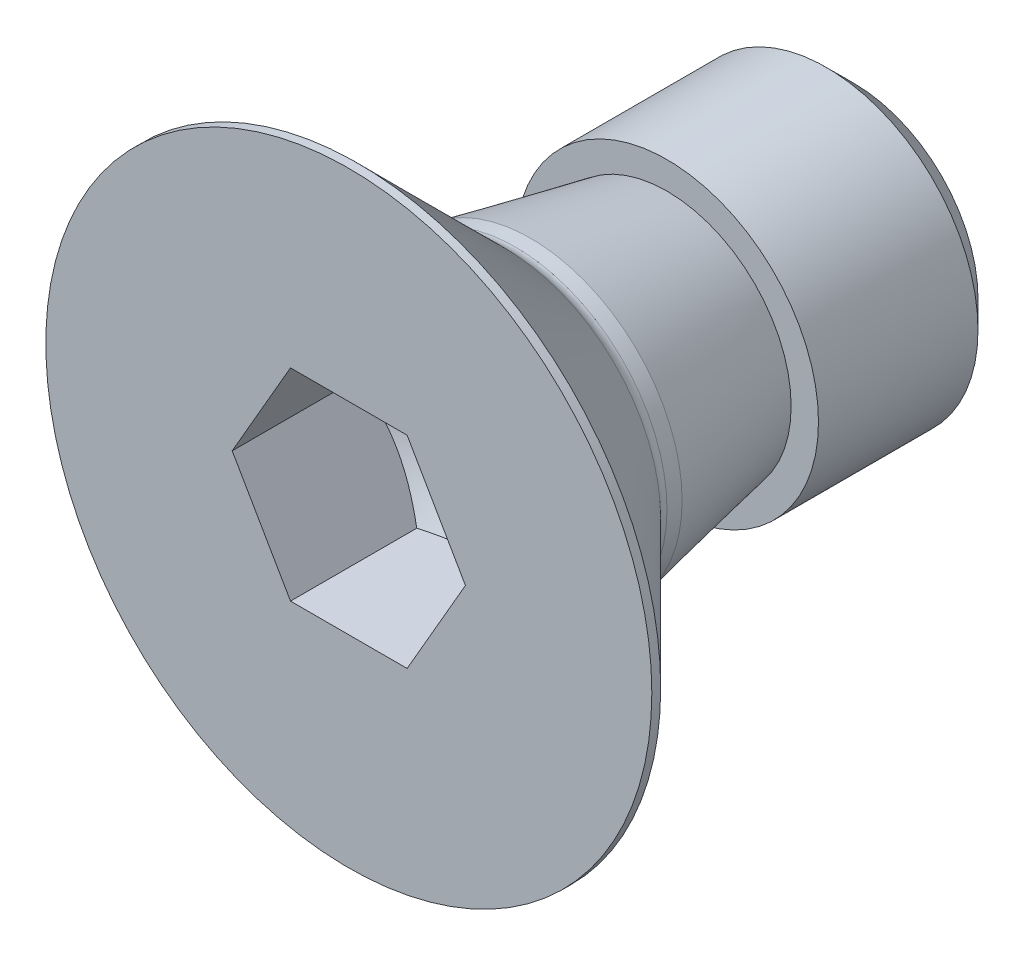
ISO-10303-21;
HEADER;
FILE_DESCRIPTION(('STEP AP214'),'2;1');
FILE_NAME('part.step','',(''),(''),'','','');
FILE_SCHEMA(('AUTOMOTIVE_DESIGN { 1 0 10303 214 1 1 1 1 }'));
ENDSEC;
DATA;
#1=APPLICATION_CONTEXT('core data for automotive mechanical design processes');
#2=APPLICATION_PROTOCOL_DEFINITION('international standard','automotive_design',2000,#1);
#3=PRODUCT_CONTEXT('',#1,'mechanical');
#4=PRODUCT('Part','Part','',(#3));
#5=PRODUCT_RELATED_PRODUCT_CATEGORY('part','',(#4));
#6=PRODUCT_DEFINITION_FORMATION('','',#4);
#7=PRODUCT_DEFINITION_CONTEXT('part definition',#1,'design');
#8=PRODUCT_DEFINITION('design','',#6,#7);
#9=PRODUCT_DEFINITION_SHAPE('','',#8);
#10=(LENGTH_UNIT() NAMED_UNIT(*) SI_UNIT(.MILLI.,.METRE.));
#11=(NAMED_UNIT(*) PLANE_ANGLE_UNIT() SI_UNIT($,.RADIAN.));
#12=(NAMED_UNIT(*) SI_UNIT($,.STERADIAN.) SOLID_ANGLE_UNIT());
#13=UNCERTAINTY_MEASURE_WITH_UNIT(LENGTH_MEASURE(1.E-05),#10,'distance_accuracy_value','');
#14=(GEOMETRIC_REPRESENTATION_CONTEXT(3) GLOBAL_UNCERTAINTY_ASSIGNED_CONTEXT((#13)) GLOBAL_UNIT_ASSIGNED_CONTEXT((#10,
#11,#12)) REPRESENTATION_CONTEXT('',''));
#15=CARTESIAN_POINT('',(0.,0.,0.));
#16=DIRECTION('',(0.,0.,1.));
#17=DIRECTION('',(1.,0.,0.));
#18=AXIS2_PLACEMENT_3D('',#15,#16,#17);
#19=CARTESIAN_POINT('',(0.,0.,0.));
#20=DIRECTION('',(0.,0.,1.));
#21=DIRECTION('',(1.,0.,0.));
#22=AXIS2_PLACEMENT_3D('',#19,#20,#21);
#23=CYLINDRICAL_SURFACE('',#22,3.);
#24=CARTESIAN_POINT('',(0.,0.,-3.3));
#25=DIRECTION('',(0.,0.,1.));
#26=DIRECTION('',(1.,0.,0.));
#27=AXIS2_PLACEMENT_3D('',#24,#25,#26);
#28=CIRCLE('',#27,3.);
#29=CARTESIAN_POINT('',(3.,0.,-3.3));
#30=VERTEX_POINT('',#29);
#31=EDGE_CURVE('E224',#30,#30,#28,.T.);
#32=ORIENTED_EDGE('',*,*,#31,.F.);
#33=EDGE_LOOP('',(#32));
#34=FACE_BOUND('',#33,.T.);
#35=CARTESIAN_POINT('',(0.,0.,-3.6));
#36=DIRECTION('',(0.,0.,1.));
#37=DIRECTION('',(1.,0.,0.));
#38=AXIS2_PLACEMENT_3D('',#35,#36,#37);
#39=CIRCLE('',#38,3.);
#40=CARTESIAN_POINT('',(3.,0.,-3.6));
#41=VERTEX_POINT('',#40);
#42=EDGE_CURVE('E152',#41,#41,#39,.T.);
#43=ORIENTED_EDGE('',*,*,#42,.T.);
#44=EDGE_LOOP('',(#43));
#45=FACE_BOUND('',#44,.T.);
#46=ADVANCED_FACE('F16',(#34,#45),#23,.T.);
#47=CARTESIAN_POINT('',(0.,6.,0.));
#48=DIRECTION('',(0.,0.,-1.));
#49=DIRECTION('',(-1.,0.,0.));
#50=AXIS2_PLACEMENT_3D('',#47,#48,#49);
#51=PLANE('',#50);
#52=CARTESIAN_POINT('',(0.,0.,0.));
#53=DIRECTION('',(0.,0.,1.));
#54=DIRECTION('',(1.,0.,0.));
#55=AXIS2_PLACEMENT_3D('',#52,#53,#54);
#56=CIRCLE('',#55,6.);
#57=CARTESIAN_POINT('',(6.,0.,0.));
#58=VERTEX_POINT('',#57);
#59=EDGE_CURVE('E206',#58,#58,#56,.T.);
#60=ORIENTED_EDGE('',*,*,#59,.T.);
#61=EDGE_LOOP('',(#60));
#62=FACE_BOUND('',#61,.T.);
#63=DIRECTION('',(0.5,-0.866025403784439,0.));
#64=VECTOR('',#63,1.);
#65=CARTESIAN_POINT('',(1.1547,1.99999906749978,0.));
#66=LINE('',#65,#64);
#67=CARTESIAN_POINT('',(1.1547,1.99999906749978,0.));
#68=VERTEX_POINT('',#67);
#69=CARTESIAN_POINT('',(2.3094,0.,0.));
#70=VERTEX_POINT('',#69);
#71=EDGE_CURVE('E94',#68,#70,#66,.T.);
#72=ORIENTED_EDGE('',*,*,#71,.T.);
#73=DIRECTION('',(-0.5,-0.866025403784439,0.));
#74=VECTOR('',#73,1.);
#75=CARTESIAN_POINT('',(2.3094,0.,0.));
#76=LINE('',#75,#74);
#77=CARTESIAN_POINT('',(1.1547,-1.99999906749978,0.));
#78=VERTEX_POINT('',#77);
#79=EDGE_CURVE('E106',#70,#78,#76,.T.);
#80=ORIENTED_EDGE('',*,*,#79,.T.);
#81=DIRECTION('',(-1.,0.,0.));
#82=VECTOR('',#81,1.);
#83=CARTESIAN_POINT('',(1.1547,-1.99999906749978,0.));
#84=LINE('',#83,#82);
#85=CARTESIAN_POINT('',(-1.1547,-1.99999906749978,0.));
#86=VERTEX_POINT('',#85);
#87=EDGE_CURVE('E195',#78,#86,#84,.T.);
#88=ORIENTED_EDGE('',*,*,#87,.T.);
#89=DIRECTION('',(-0.5,0.866025403784439,0.));
#90=VECTOR('',#89,1.);
#91=CARTESIAN_POINT('',(-1.1547,-1.99999906749978,0.));
#92=LINE('',#91,#90);
#93=CARTESIAN_POINT('',(-2.3094,0.,0.));
#94=VERTEX_POINT('',#93);
#95=EDGE_CURVE('E191',#86,#94,#92,.T.);
#96=ORIENTED_EDGE('',*,*,#95,.T.);
#97=DIRECTION('',(0.5,0.866025403784439,0.));
#98=VECTOR('',#97,1.);
#99=CARTESIAN_POINT('',(-2.3094,0.,0.));
#100=LINE('',#99,#98);
#101=CARTESIAN_POINT('',(-1.1547,1.99999906749978,0.));
#102=VERTEX_POINT('',#101);
#103=EDGE_CURVE('E90',#94,#102,#100,.T.);
#104=ORIENTED_EDGE('',*,*,#103,.T.);
#105=DIRECTION('',(1.,0.,0.));
#106=VECTOR('',#105,1.);
#107=CARTESIAN_POINT('',(-1.1547,1.99999906749978,0.));
#108=LINE('',#107,#106);
#109=EDGE_CURVE('E130',#102,#68,#108,.T.);
#110=ORIENTED_EDGE('',*,*,#109,.T.);
#111=EDGE_LOOP('',(#72,#80,#88,#96,#104,#110));
#112=FACE_BOUND('',#111,.T.);
#113=ADVANCED_FACE('F18',(#62,#112),#51,.F.);
#114=CARTESIAN_POINT('',(0.,0.,-3.3));
#115=DIRECTION('',(0.,0.,1.));
#116=DIRECTION('',(1.,0.,0.));
#117=AXIS2_PLACEMENT_3D('',#114,#115,#116);
#118=TOROIDAL_SURFACE('',#117,3.3,0.3);
#119=ORIENTED_EDGE('',*,*,#31,.T.);
#120=EDGE_LOOP('',(#119));
#121=FACE_BOUND('',#120,.T.);
#122=CARTESIAN_POINT('',(0.,0.,-3.08786796564404));
#123=DIRECTION('',(0.,0.,1.));
#124=DIRECTION('',(1.,0.,0.));
#125=AXIS2_PLACEMENT_3D('',#122,#123,#124);
#126=CIRCLE('',#125,3.08786796564404);
#127=CARTESIAN_POINT('',(3.08786796564404,0.,-3.08786796564404));
#128=VERTEX_POINT('',#127);
#129=EDGE_CURVE('E218',#128,#128,#126,.T.);
#130=ORIENTED_EDGE('',*,*,#129,.F.);
#131=EDGE_LOOP('',(#130));
#132=FACE_BOUND('',#131,.T.);
#133=ADVANCED_FACE('F257',(#121,#132),#118,.F.);
#134=CARTESIAN_POINT('',(0.,0.,-3.08786796564404));
#135=DIRECTION('',(0.,0.,1.));
#136=DIRECTION('',(1.,0.,0.));
#137=AXIS2_PLACEMENT_3D('',#134,#135,#136);
#138=CONICAL_SURFACE('',#137,3.08786796564404,0.785398163397448);
#139=CARTESIAN_POINT('',(0.,0.,-0.175735931288071));
#140=DIRECTION('',(0.,0.,1.));
#141=DIRECTION('',(1.,0.,0.));
#142=AXIS2_PLACEMENT_3D('',#139,#140,#141);
#143=CIRCLE('',#142,6.);
#144=CARTESIAN_POINT('',(6.,0.,-0.175735931288071));
#145=VERTEX_POINT('',#144);
#146=EDGE_CURVE('E211',#145,#145,#143,.T.);
#147=ORIENTED_EDGE('',*,*,#146,.F.);
#148=EDGE_LOOP('',(#147));
#149=FACE_BOUND('',#148,.T.);
#150=ORIENTED_EDGE('',*,*,#129,.T.);
#151=EDGE_LOOP('',(#150));
#152=FACE_BOUND('',#151,.T.);
#153=ADVANCED_FACE('F352',(#149,#152),#138,.T.);
#154=CARTESIAN_POINT('',(0.,0.,0.));
#155=DIRECTION('',(0.,0.,1.));
#156=DIRECTION('',(1.,0.,0.));
#157=AXIS2_PLACEMENT_3D('',#154,#155,#156);
#158=CYLINDRICAL_SURFACE('',#157,6.);
#159=ORIENTED_EDGE('',*,*,#59,.F.);
#160=EDGE_LOOP('',(#159));
#161=FACE_BOUND('',#160,.T.);
#162=ORIENTED_EDGE('',*,*,#146,.T.);
#163=EDGE_LOOP('',(#162));
#164=FACE_BOUND('',#163,.T.);
#165=ADVANCED_FACE('F182',(#161,#164),#158,.T.);
#166=CARTESIAN_POINT('',(1.1547,1.99999906749978,-4.83333271166652));
#167=DIRECTION('',(-0.866025403784439,-0.5,0.));
#168=DIRECTION('',(-0.5,0.866025403784439,0.));
#169=AXIS2_PLACEMENT_3D('',#166,#167,#168);
#170=PLANE('',#169);
#171=DIRECTION('',(0.,0.,1.));
#172=VECTOR('',#171,1.);
#173=CARTESIAN_POINT('',(1.1547,1.99999906749978,-4.83333271166652));
#174=LINE('',#173,#172);
#175=CARTESIAN_POINT('',(1.1547,1.99999906749978,-2.5));
#176=VERTEX_POINT('',#175);
#177=EDGE_CURVE('E32',#176,#68,#174,.T.);
#178=ORIENTED_EDGE('',*,*,#177,.F.);
#179=CARTESIAN_POINT('',(2.30940115470054,-2.E-06,-2.49999933333283));
#180=CARTESIAN_POINT('',(2.2586590633301,0.0878858803359067,-2.5293038293001));
#181=CARTESIAN_POINT('',(2.20747896699173,0.176532407530229,-2.55595474306228));
#182=CARTESIAN_POINT('',(2.10423262359364,0.355360319991423,-2.60247313178679));
#183=CARTESIAN_POINT('',(2.05216454263161,0.445544881670276,-2.62232415206953));
#184=CARTESIAN_POINT('',(1.94867363491875,0.624796391950367,-2.6532237225643));
#185=CARTESIAN_POINT('',(1.8972667271894,0.713835767997602,-2.66447795007664));
#186=CARTESIAN_POINT('',(1.79421114915164,0.892333265162389,-2.67791068197366));
#187=CARTESIAN_POINT('',(1.74256285316985,0.981790737927202,-2.68010031244233));
#188=CARTESIAN_POINT('',(1.64606340062569,1.14893269263626,-2.67553370899009));
#189=CARTESIAN_POINT('',(1.60119776416565,1.22664225449897,-2.66989872764051));
#190=CARTESIAN_POINT('',(1.51175877649126,1.38155512532854,-2.65204269039871));
#191=CARTESIAN_POINT('',(1.46718573439589,1.45875789888563,-2.63981554077999));
#192=CARTESIAN_POINT('',(1.37756249119973,1.61398990964047,-2.60925000764278));
#193=CARTESIAN_POINT('',(1.33252362751513,1.69199950985737,-2.59078211816702));
#194=CARTESIAN_POINT('',(1.2431174638359,1.84685552785963,-2.5488678067805));
#195=CARTESIAN_POINT('',(1.19874901931202,1.92370392802778,-2.52543122686168));
#196=CARTESIAN_POINT('',(1.15469884529946,2.00000106749979,-2.49999933333283));
#197=B_SPLINE_CURVE_WITH_KNOTS('',3,(#179,#180,#181,#182,#183,#184,#185,#186,#187,#188,#189,
#190,#191,#192,#193,#194,#195,#196),.UNSPECIFIED.,.F.,.F.,(4,2,2,2,2,2,2,2,4),(0.,
0.317016021868474,0.634793841625279,0.944707629264744,1.2542409089752,1.52370869907371,
1.79342601033585,2.06912439061208,2.34428168581532),.UNSPECIFIED.);
#198=CARTESIAN_POINT('',(2.3094,0.,-2.5));
#199=VERTEX_POINT('',#198);
#200=EDGE_CURVE('E81',#199,#176,#197,.T.);
#201=ORIENTED_EDGE('',*,*,#200,.F.);
#202=DIRECTION('',(0.,0.,1.));
#203=VECTOR('',#202,1.);
#204=CARTESIAN_POINT('',(2.3094,0.,-4.83333271166652));
#205=LINE('',#204,#203);
#206=EDGE_CURVE('E121',#199,#70,#205,.T.);
#207=ORIENTED_EDGE('',*,*,#206,.T.);
#208=ORIENTED_EDGE('',*,*,#71,.F.);
#209=EDGE_LOOP('',(#178,#201,#207,#208));
#210=FACE_BOUND('',#209,.T.);
#211=ADVANCED_FACE('F92',(#210),#170,.T.);
#212=CARTESIAN_POINT('',(2.3094,0.,-4.83333271166652));
#213=DIRECTION('',(-0.866025403784439,0.5,0.));
#214=DIRECTION('',(0.5,0.866025403784439,0.));
#215=AXIS2_PLACEMENT_3D('',#212,#213,#214);
#216=PLANE('',#215);
#217=ORIENTED_EDGE('',*,*,#206,.F.);
#218=CARTESIAN_POINT('',(1.15469884529946,-2.00000106749979,-2.49999933333283));
#219=CARTESIAN_POINT('',(1.2054409366699,-1.91211318716388,-2.5293038293001));
#220=CARTESIAN_POINT('',(1.25662103300827,-1.82346665996955,-2.55595474306228));
#221=CARTESIAN_POINT('',(1.35986737640636,-1.64463874750836,-2.60247313178679));
#222=CARTESIAN_POINT('',(1.41193545736839,-1.55445418582951,-2.62232415206953));
#223=CARTESIAN_POINT('',(1.51542636508125,-1.37520267554942,-2.6532237225643));
#224=CARTESIAN_POINT('',(1.5668332728106,-1.28616329950218,-2.66447795007665));
#225=CARTESIAN_POINT('',(1.66988885084836,-1.10766580233739,-2.67791068197366));
#226=CARTESIAN_POINT('',(1.72153714683015,-1.01820832957258,-2.68010031244233));
#227=CARTESIAN_POINT('',(1.81803659937431,-0.851066374863523,-2.67553370899009));
#228=CARTESIAN_POINT('',(1.86290223583435,-0.773356813000813,-2.66989872764051));
#229=CARTESIAN_POINT('',(1.95234122350874,-0.618443942171245,-2.65204269039871));
#230=CARTESIAN_POINT('',(1.99691426560411,-0.541241168614151,-2.63981554077999));
#231=CARTESIAN_POINT('',(2.08653750880027,-0.386009157859312,-2.60925000764278));
#232=CARTESIAN_POINT('',(2.13157637248487,-0.307999557642412,-2.59078211816702));
#233=CARTESIAN_POINT('',(2.2209825361641,-0.153143539640156,-2.5488678067805));
#234=CARTESIAN_POINT('',(2.26535098068798,-0.0762951394720067,-2.52543122686169));
#235=CARTESIAN_POINT('',(2.30940115470054,1.99999999974114E-06,-2.49999933333283));
#236=B_SPLINE_CURVE_WITH_KNOTS('',3,(#218,#219,#220,#221,#222,#223,#224,#225,#226,#227,#228,
#229,#230,#231,#232,#233,#234,#235),.UNSPECIFIED.,.F.,.F.,(4,2,2,2,2,2,2,2,4),(0.,
0.317016021868474,0.63479384162528,0.944707629264745,1.2542409089752,1.52370869907371,
1.79342601033585,2.06912439061208,2.34428168581532),.UNSPECIFIED.);
#237=CARTESIAN_POINT('',(1.1547,-1.99999906749978,-2.5));
#238=VERTEX_POINT('',#237);
#239=EDGE_CURVE('E85',#238,#199,#236,.T.);
#240=ORIENTED_EDGE('',*,*,#239,.F.);
#241=DIRECTION('',(0.,0.,1.));
#242=VECTOR('',#241,1.);
#243=CARTESIAN_POINT('',(1.1547,-1.99999906749978,-4.83333271166652));
#244=LINE('',#243,#242);
#245=EDGE_CURVE('E117',#238,#78,#244,.T.);
#246=ORIENTED_EDGE('',*,*,#245,.T.);
#247=ORIENTED_EDGE('',*,*,#79,.F.);
#248=EDGE_LOOP('',(#217,#240,#246,#247));
#249=FACE_BOUND('',#248,.T.);
#250=ADVANCED_FACE('F173',(#249),#216,.T.);
#251=CARTESIAN_POINT('',(1.1547,-1.99999906749978,-4.83333271166652));
#252=DIRECTION('',(0.,1.,0.));
#253=DIRECTION('',(1.,0.,0.));
#254=AXIS2_PLACEMENT_3D('',#251,#252,#253);
#255=PLANE('',#254);
#256=ORIENTED_EDGE('',*,*,#245,.F.);
#257=CARTESIAN_POINT('',(-2.99028884971983,-1.99999906749978,-1.75632976874141));
#258=CARTESIAN_POINT('',(-2.90392200266685,-1.99999906749978,-1.79776531378645));
#259=CARTESIAN_POINT('',(-2.81734475420192,-1.99999906749978,-1.83877047617452));
#260=CARTESIAN_POINT('',(-2.64365731596042,-1.99999906749978,-1.91967588671038));
#261=CARTESIAN_POINT('',(-2.55654703367194,-1.99999906749978,-1.95957593601128));
#262=CARTESIAN_POINT('',(-2.38118192431167,-1.99999906749978,-2.03824987385071));
#263=CARTESIAN_POINT('',(-2.29292335976907,-1.99999906749978,-2.0770154628644));
#264=CARTESIAN_POINT('',(-2.11566562283863,-1.99999906749978,-2.15280829514554));
#265=CARTESIAN_POINT('',(-2.02666648924309,-1.99999906749978,-2.18983562879937));
#266=CARTESIAN_POINT('',(-1.84544164627787,-1.99999906749978,-2.26263193927394));
#267=CARTESIAN_POINT('',(-1.75319241539257,-1.99999906749978,-2.29834270374423));
#268=CARTESIAN_POINT('',(-1.56757813216983,-1.99999906749978,-2.3667952135221));
#269=CARTESIAN_POINT('',(-1.47421295183128,-1.99999906749978,-2.39953661446758));
#270=CARTESIAN_POINT('',(-1.28643386768821,-1.99999906749978,-2.461114084214));
#271=CARTESIAN_POINT('',(-1.19202295783748,-1.99999906749978,-2.48995918462234));
#272=CARTESIAN_POINT('',(-1.00184812907594,-1.99999906749978,-2.54275765512681));
#273=CARTESIAN_POINT('',(-0.906084552528721,-1.99999906749978,-2.56671224011933));
#274=CARTESIAN_POINT('',(-0.713403648485675,-1.99999906749978,-2.60845249556217));
#275=CARTESIAN_POINT('',(-0.616489120401835,-1.99999906749978,-2.62625083619467));
#276=CARTESIAN_POINT('',(-0.421576462996769,-1.99999906749978,-2.65451397242418));
#277=CARTESIAN_POINT('',(-0.323578407356965,-1.99999906749978,-2.66497926360126));
#278=CARTESIAN_POINT('',(-0.128212352021125,-1.99999906749978,-2.67760223432232));
#279=CARTESIAN_POINT('',(-0.0308508716606802,-1.99999906749978,-2.67985794966474));
#280=CARTESIAN_POINT('',(0.163710831550759,-1.99999906749978,-2.67613391769439));
#281=CARTESIAN_POINT('',(0.260911044043611,-1.99999906749978,-2.67015366044332));
#282=CARTESIAN_POINT('',(0.500738265811493,-1.99999906749979,-2.64576313307129));
#283=CARTESIAN_POINT('',(0.642900579770634,-1.99999906749978,-2.62278195626825));
#284=CARTESIAN_POINT('',(0.924460633233846,-1.99999906749978,-2.56352019588128));
#285=CARTESIAN_POINT('',(1.06385482642399,-1.99999906749978,-2.52722358332146));
#286=CARTESIAN_POINT('',(1.27233418248366,-1.99999906749978,-2.46522008660532));
#287=CARTESIAN_POINT('',(1.3424969926884,-1.99999906749978,-2.44300330997084));
#288=CARTESIAN_POINT('',(1.48209226240527,-1.99999906749978,-2.39651457885398));
#289=CARTESIAN_POINT('',(1.55152514771462,-1.99999906749978,-2.3722439069613));
#290=CARTESIAN_POINT('',(1.68975335664335,-1.99999906749978,-2.32199986551132));
#291=CARTESIAN_POINT('',(1.75854879355,-1.99999906749978,-2.29602680539379));
#292=CARTESIAN_POINT('',(1.89559758268158,-1.99999906749978,-2.24265892814057));
#293=CARTESIAN_POINT('',(1.9638508410586,-1.99999906749978,-2.21526387079319));
#294=CARTESIAN_POINT('',(2.13806940290074,-1.99999906749978,-2.14358227153185));
#295=CARTESIAN_POINT('',(2.24368635497214,-1.99999906749978,-2.098449983887));
#296=CARTESIAN_POINT('',(2.45396650508346,-1.99999906749978,-2.00600978016749));
#297=CARTESIAN_POINT('',(2.55862963096903,-1.99999906749978,-1.95870170111037));
#298=CARTESIAN_POINT('',(2.87150608038439,-1.99999906749978,-1.81428076597337));
#299=CARTESIAN_POINT('',(3.0785715280017,-1.99999906749978,-1.71468601761965));
#300=CARTESIAN_POINT('',(3.49093339473319,-1.99999906749978,-1.51131953317204));
#301=CARTESIAN_POINT('',(3.69622732620256,-1.99999906749978,-1.4075428127));
#302=CARTESIAN_POINT('',(4.10540863094205,-1.99999906749978,-1.19732093254039));
#303=CARTESIAN_POINT('',(4.30929617883657,-1.99999906749978,-1.09087611203119));
#304=CARTESIAN_POINT('',(4.69689964068717,-1.99999906749978,-0.886281973595515));
#305=CARTESIAN_POINT('',(4.8807031106818,-1.99999906749978,-0.788297954988632));
#306=CARTESIAN_POINT('',(5.24771880693925,-1.99999906749978,-0.591213485253678));
#307=CARTESIAN_POINT('',(5.43093101099718,-1.99999906749978,-0.492112992810103));
#308=CARTESIAN_POINT('',(5.79643447179695,-1.99999906749978,-0.293328682858391));
#309=CARTESIAN_POINT('',(5.97872688569658,-1.99999906749978,-0.19364699016684));
#310=CARTESIAN_POINT('',(6.34294316034774,-1.99999906749978,0.00636518212678593));
#311=CARTESIAN_POINT('',(6.52486703988709,-1.99999906749978,0.106695627503686));
#312=CARTESIAN_POINT('',(6.70665851322056,-1.99999906749978,0.207263972114798));
#313=B_SPLINE_CURVE_WITH_KNOTS('',3,(#257,#258,#259,#260,#261,#262,#263,#264,#265,#266,#267,
#268,#269,#270,#271,#272,#273,#274,#275,#276,#277,#278,#279,#280,#281,#282,#283,#284,#285,#286,
#287,#288,#289,#290,#291,#292,#293,#294,#295,#296,#297,#298,#299,#300,#301,#302,#303,#304,#305,
#306,#307,#308,#309,#310,#311,#312),.UNSPECIFIED.,.F.,.F.,(4,2,2,2,2,2,2,2,2,2,2,2,2,2,2,2,2,2,
2,2,2,2,2,2,2,2,2,4),(0.,0.287380545294455,0.574812468409965,0.863987963789068,1.15314840582959,
1.44986914395045,1.74662424938927,2.04267922006207,2.33866055535835,2.63402905460955,
2.92937759042407,3.22118738911306,3.51301525630367,3.94415234632138,4.37581014668741,
4.59657452134229,4.81720203911729,5.0377895644822,5.25841447476323,5.60294646675355,
5.94750430884218,6.63673379533742,7.32681057136868,8.01680006289313,8.6416646832095,
9.26655250331282,9.88985091588627,10.513116710133),.UNSPECIFIED.);
#314=CARTESIAN_POINT('',(-1.1547,-1.99999906749978,-2.5));
#315=VERTEX_POINT('',#314);
#316=EDGE_CURVE('E160',#315,#238,#313,.T.);
#317=ORIENTED_EDGE('',*,*,#316,.F.);
#318=DIRECTION('',(0.,0.,1.));
#319=VECTOR('',#318,1.);
#320=CARTESIAN_POINT('',(-1.1547,-1.99999906749978,-4.83333271166652));
#321=LINE('',#320,#319);
#322=EDGE_CURVE('E113',#315,#86,#321,.T.);
#323=ORIENTED_EDGE('',*,*,#322,.T.);
#324=ORIENTED_EDGE('',*,*,#87,.F.);
#325=EDGE_LOOP('',(#256,#317,#323,#324));
#326=FACE_BOUND('',#325,.T.);
#327=ADVANCED_FACE('F170',(#326),#255,.T.);
#328=CARTESIAN_POINT('',(-1.1547,-1.99999906749978,-4.83333271166652));
#329=DIRECTION('',(0.866025403784439,0.5,0.));
#330=DIRECTION('',(0.5,-0.866025403784439,0.));
#331=AXIS2_PLACEMENT_3D('',#328,#329,#330);
#332=PLANE('',#331);
#333=ORIENTED_EDGE('',*,*,#322,.F.);
#334=CARTESIAN_POINT('',(-2.30940115470054,1.99999999948187E-06,-2.49999933333283));
#335=CARTESIAN_POINT('',(-2.2586590633301,-0.0878858803359073,-2.5293038293001));
#336=CARTESIAN_POINT('',(-2.20747896699173,-0.17653240753023,-2.55595474306228));
#337=CARTESIAN_POINT('',(-2.10423262359364,-0.355360319991424,-2.60247313178679));
#338=CARTESIAN_POINT('',(-2.05216454263161,-0.445544881670277,-2.62232415206953));
#339=CARTESIAN_POINT('',(-1.94867363491875,-0.624796391950368,-2.6532237225643));
#340=CARTESIAN_POINT('',(-1.8972667271894,-0.713835767997602,-2.66447795007665));
#341=CARTESIAN_POINT('',(-1.79421114915164,-0.89233326516239,-2.67791068197366));
#342=CARTESIAN_POINT('',(-1.74256285316985,-0.981790737927202,-2.68010031244233));
#343=CARTESIAN_POINT('',(-1.64606340062569,-1.14893269263626,-2.67553370899009));
#344=CARTESIAN_POINT('',(-1.60119776416565,-1.22664225449897,-2.66989872764051));
#345=CARTESIAN_POINT('',(-1.51175877649126,-1.38155512532854,-2.65204269039871));
#346=CARTESIAN_POINT('',(-1.46718573439589,-1.45875789888563,-2.63981554077999));
#347=CARTESIAN_POINT('',(-1.37756249119973,-1.61398990964047,-2.60925000764278));
#348=CARTESIAN_POINT('',(-1.33252362751513,-1.69199950985737,-2.59078211816702));
#349=CARTESIAN_POINT('',(-1.2431174638359,-1.84685552785963,-2.5488678067805));
#350=CARTESIAN_POINT('',(-1.19874901931202,-1.92370392802778,-2.52543122686168));
#351=CARTESIAN_POINT('',(-1.15469884529946,-2.00000106749979,-2.49999933333283));
#352=B_SPLINE_CURVE_WITH_KNOTS('',3,(#334,#335,#336,#337,#338,#339,#340,#341,#342,#343,#344,
#345,#346,#347,#348,#349,#350,#351),.UNSPECIFIED.,.F.,.F.,(4,2,2,2,2,2,2,2,4),(0.,
0.317016021868474,0.634793841625279,0.944707629264744,1.2542409089752,1.52370869907371,
1.79342601033585,2.06912439061208,2.34428168581532),.UNSPECIFIED.);
#353=CARTESIAN_POINT('',(-2.3094,0.,-2.5));
#354=VERTEX_POINT('',#353);
#355=EDGE_CURVE('E151',#354,#315,#352,.T.);
#356=ORIENTED_EDGE('',*,*,#355,.F.);
#357=DIRECTION('',(0.,0.,1.));
#358=VECTOR('',#357,1.);
#359=CARTESIAN_POINT('',(-2.3094,0.,-4.83333271166652));
#360=LINE('',#359,#358);
#361=EDGE_CURVE('E103',#354,#94,#360,.T.);
#362=ORIENTED_EDGE('',*,*,#361,.T.);
#363=ORIENTED_EDGE('',*,*,#95,.F.);
#364=EDGE_LOOP('',(#333,#356,#362,#363));
#365=FACE_BOUND('',#364,.T.);
#366=ADVANCED_FACE('F141',(#365),#332,.T.);
#367=CARTESIAN_POINT('',(-2.3094,0.,-4.83333271166652));
#368=DIRECTION('',(0.866025403784439,-0.5,0.));
#369=DIRECTION('',(-0.5,-0.866025403784439,0.));
#370=AXIS2_PLACEMENT_3D('',#367,#368,#369);
#371=PLANE('',#370);
#372=ORIENTED_EDGE('',*,*,#361,.F.);
#373=CARTESIAN_POINT('',(-1.15469884529946,2.00000106749979,-2.49999933333283));
#374=CARTESIAN_POINT('',(-1.2054409366699,1.91211318716388,-2.5293038293001));
#375=CARTESIAN_POINT('',(-1.25662103300827,1.82346665996956,-2.55595474306228));
#376=CARTESIAN_POINT('',(-1.35986737640636,1.64463874750836,-2.60247313178679));
#377=CARTESIAN_POINT('',(-1.41193545736839,1.55445418582951,-2.62232415206953));
#378=CARTESIAN_POINT('',(-1.51542636508125,1.37520267554942,-2.6532237225643));
#379=CARTESIAN_POINT('',(-1.5668332728106,1.28616329950218,-2.66447795007665));
#380=CARTESIAN_POINT('',(-1.66988885084836,1.10766580233739,-2.67791068197366));
#381=CARTESIAN_POINT('',(-1.72153714683015,1.01820832957258,-2.68010031244233));
#382=CARTESIAN_POINT('',(-1.81803659937431,0.851066374863522,-2.67553370899009));
#383=CARTESIAN_POINT('',(-1.86290223583435,0.773356813000813,-2.66989872764051));
#384=CARTESIAN_POINT('',(-1.95234122350874,0.618443942171244,-2.65204269039871));
#385=CARTESIAN_POINT('',(-1.99691426560411,0.54124116861415,-2.63981554077999));
#386=CARTESIAN_POINT('',(-2.08653750880027,0.386009157859311,-2.60925000764278));
#387=CARTESIAN_POINT('',(-2.13157637248487,0.307999557642412,-2.59078211816702));
#388=CARTESIAN_POINT('',(-2.2209825361641,0.153143539640156,-2.5488678067805));
#389=CARTESIAN_POINT('',(-2.26535098068798,0.0762951394720061,-2.52543122686169));
#390=CARTESIAN_POINT('',(-2.30940115470054,-2.0000000004077E-06,-2.49999933333283));
#391=B_SPLINE_CURVE_WITH_KNOTS('',3,(#373,#374,#375,#376,#377,#378,#379,#380,#381,#382,#383,
#384,#385,#386,#387,#388,#389,#390),.UNSPECIFIED.,.F.,.F.,(4,2,2,2,2,2,2,2,4),(0.,
0.317016021868474,0.63479384162528,0.944707629264746,1.2542409089752,1.52370869907371,
1.79342601033586,2.06912439061208,2.34428168581532),.UNSPECIFIED.);
#392=CARTESIAN_POINT('',(-1.1547,1.99999906749978,-2.5));
#393=VERTEX_POINT('',#392);
#394=EDGE_CURVE('E40',#393,#354,#391,.T.);
#395=ORIENTED_EDGE('',*,*,#394,.F.);
#396=DIRECTION('',(0.,0.,1.));
#397=VECTOR('',#396,1.);
#398=CARTESIAN_POINT('',(-1.1547,1.99999906749978,-4.83333271166652));
#399=LINE('',#398,#397);
#400=EDGE_CURVE('E97',#393,#102,#399,.T.);
#401=ORIENTED_EDGE('',*,*,#400,.T.);
#402=ORIENTED_EDGE('',*,*,#103,.F.);
#403=EDGE_LOOP('',(#372,#395,#401,#402));
#404=FACE_BOUND('',#403,.T.);
#405=ADVANCED_FACE('F137',(#404),#371,.T.);
#406=CARTESIAN_POINT('',(-1.1547,1.99999906749978,-4.83333271166652));
#407=DIRECTION('',(0.,-1.,0.));
#408=DIRECTION('',(-1.,0.,0.));
#409=AXIS2_PLACEMENT_3D('',#406,#407,#408);
#410=PLANE('',#409);
#411=ORIENTED_EDGE('',*,*,#400,.F.);
#412=CARTESIAN_POINT('',(-2.99028884971983,1.99999906749978,-1.75632976874141));
#413=CARTESIAN_POINT('',(-2.90392200266685,1.99999906749978,-1.79776531378645));
#414=CARTESIAN_POINT('',(-2.81734475420192,1.99999906749978,-1.83877047617452));
#415=CARTESIAN_POINT('',(-2.64365731596042,1.99999906749978,-1.91967588671039));
#416=CARTESIAN_POINT('',(-2.55654703367194,1.99999906749978,-1.95957593601128));
#417=CARTESIAN_POINT('',(-2.38118192431167,1.99999906749978,-2.03824987385071));
#418=CARTESIAN_POINT('',(-2.29292335976907,1.99999906749978,-2.07701546286441));
#419=CARTESIAN_POINT('',(-2.11566562283863,1.99999906749978,-2.15280829514554));
#420=CARTESIAN_POINT('',(-2.02666648924309,1.99999906749978,-2.18983562879937));
#421=CARTESIAN_POINT('',(-1.84544164627787,1.99999906749978,-2.26263193927394));
#422=CARTESIAN_POINT('',(-1.75319241539256,1.99999906749978,-2.29834270374423));
#423=CARTESIAN_POINT('',(-1.56757813216983,1.99999906749978,-2.3667952135221));
#424=CARTESIAN_POINT('',(-1.47421295183128,1.99999906749978,-2.39953661446758));
#425=CARTESIAN_POINT('',(-1.28643386768821,1.99999906749978,-2.461114084214));
#426=CARTESIAN_POINT('',(-1.19202295783748,1.99999906749978,-2.48995918462234));
#427=CARTESIAN_POINT('',(-1.00184812907594,1.99999906749978,-2.54275765512681));
#428=CARTESIAN_POINT('',(-0.906084552528723,1.99999906749978,-2.56671224011933));
#429=CARTESIAN_POINT('',(-0.713403648485677,1.99999906749978,-2.60845249556217));
#430=CARTESIAN_POINT('',(-0.616489120401837,1.99999906749978,-2.62625083619467));
#431=CARTESIAN_POINT('',(-0.421576462996772,1.99999906749978,-2.65451397242418));
#432=CARTESIAN_POINT('',(-0.323578407356967,1.99999906749978,-2.66497926360126));
#433=CARTESIAN_POINT('',(-0.128212352021128,1.99999906749978,-2.67760223432232));
#434=CARTESIAN_POINT('',(-0.0308508716606829,1.99999906749978,-2.67985794966474));
#435=CARTESIAN_POINT('',(0.163710831550757,1.99999906749978,-2.67613391769439));
#436=CARTESIAN_POINT('',(0.260911044043609,1.99999906749978,-2.67015366044332));
#437=CARTESIAN_POINT('',(0.500738265811491,1.99999906749979,-2.64576313307129));
#438=CARTESIAN_POINT('',(0.642900579770633,1.99999906749978,-2.62278195626825));
#439=CARTESIAN_POINT('',(0.924460633233845,1.99999906749978,-2.56352019588128));
#440=CARTESIAN_POINT('',(1.06385482642399,1.99999906749978,-2.52722358332146));
#441=CARTESIAN_POINT('',(1.27233418248366,1.99999906749978,-2.46522008660532));
#442=CARTESIAN_POINT('',(1.3424969926884,1.99999906749978,-2.44300330997084));
#443=CARTESIAN_POINT('',(1.48209226240527,1.99999906749978,-2.39651457885398));
#444=CARTESIAN_POINT('',(1.55152514771462,1.99999906749978,-2.3722439069613));
#445=CARTESIAN_POINT('',(1.68975335664335,1.99999906749978,-2.32199986551132));
#446=CARTESIAN_POINT('',(1.75854879355,1.99999906749978,-2.29602680539379));
#447=CARTESIAN_POINT('',(1.89559758268158,1.99999906749978,-2.24265892814057));
#448=CARTESIAN_POINT('',(1.9638508410586,1.99999906749978,-2.21526387079319));
#449=CARTESIAN_POINT('',(2.13806940290074,1.99999906749979,-2.14358227153185));
#450=CARTESIAN_POINT('',(2.24368635497214,1.99999906749978,-2.098449983887));
#451=CARTESIAN_POINT('',(2.45396650508345,1.99999906749978,-2.00600978016749));
#452=CARTESIAN_POINT('',(2.55862963096903,1.99999906749978,-1.95870170111037));
#453=CARTESIAN_POINT('',(2.87150608038439,1.99999906749978,-1.81428076597336));
#454=CARTESIAN_POINT('',(3.0785715280017,1.99999906749978,-1.71468601761965));
#455=CARTESIAN_POINT('',(3.49093339473319,1.99999906749978,-1.51131953317204));
#456=CARTESIAN_POINT('',(3.69622732620256,1.99999906749978,-1.4075428127));
#457=CARTESIAN_POINT('',(4.10540863094205,1.99999906749978,-1.19732093254039));
#458=CARTESIAN_POINT('',(4.30929617883657,1.99999906749978,-1.09087611203119));
#459=CARTESIAN_POINT('',(4.69689964068717,1.99999906749978,-0.886281973595515));
#460=CARTESIAN_POINT('',(4.8807031106818,1.99999906749978,-0.788297954988631));
#461=CARTESIAN_POINT('',(5.24771880693925,1.99999906749978,-0.591213485253678));
#462=CARTESIAN_POINT('',(5.43093101099718,1.99999906749978,-0.492112992810103));
#463=CARTESIAN_POINT('',(5.79643447179695,1.99999906749978,-0.293328682858391));
#464=CARTESIAN_POINT('',(5.97872688569658,1.99999906749978,-0.19364699016684));
#465=CARTESIAN_POINT('',(6.34294316034774,1.99999906749978,0.00636518212678605));
#466=CARTESIAN_POINT('',(6.52486703988709,1.99999906749978,0.106695627503686));
#467=CARTESIAN_POINT('',(6.70665851322056,1.99999906749978,0.207263972114799));
#468=B_SPLINE_CURVE_WITH_KNOTS('',3,(#412,#413,#414,#415,#416,#417,#418,#419,#420,#421,#422,
#423,#424,#425,#426,#427,#428,#429,#430,#431,#432,#433,#434,#435,#436,#437,#438,#439,#440,#441,
#442,#443,#444,#445,#446,#447,#448,#449,#450,#451,#452,#453,#454,#455,#456,#457,#458,#459,#460,
#461,#462,#463,#464,#465,#466,#467),.UNSPECIFIED.,.F.,.F.,(4,2,2,2,2,2,2,2,2,2,2,2,2,2,2,2,2,2,
2,2,2,2,2,2,2,2,2,4),(0.,0.287380545294455,0.574812468409966,0.863987963789069,1.15314840582959,
1.44986914395045,1.74662424938927,2.04267922006207,2.33866055535835,2.63402905460955,
2.92937759042407,3.22118738911306,3.51301525630367,3.94415234632138,4.37581014668741,
4.59657452134229,4.81720203911729,5.0377895644822,5.25841447476323,5.60294646675355,
5.94750430884218,6.63673379533742,7.32681057136868,8.01680006289313,8.6416646832095,
9.26655250331282,9.88985091588626,10.513116710133),.UNSPECIFIED.);
#469=EDGE_CURVE('E82',#176,#393,#468,.F.);
#470=ORIENTED_EDGE('',*,*,#469,.F.);
#471=ORIENTED_EDGE('',*,*,#177,.T.);
#472=ORIENTED_EDGE('',*,*,#109,.F.);
#473=EDGE_LOOP('',(#411,#470,#471,#472));
#474=FACE_BOUND('',#473,.T.);
#475=ADVANCED_FACE('F77',(#474),#410,.T.);
#476=CARTESIAN_POINT('',(0.,0.,-3.83333271166652));
#477=DIRECTION('',(0.,0.,1.));
#478=DIRECTION('',(1.,0.,0.));
#479=AXIS2_PLACEMENT_3D('',#476,#477,#478);
#480=CONICAL_SURFACE('',#479,0.,1.0471975511966);
#481=CARTESIAN_POINT('',(0.,0.,-3.83333271166652));
#482=VERTEX_POINT('',#481);
#483=VERTEX_LOOP('',#482);
#484=FACE_BOUND('',#483,.T.);
#485=ORIENTED_EDGE('',*,*,#200,.T.);
#486=ORIENTED_EDGE('',*,*,#469,.T.);
#487=ORIENTED_EDGE('',*,*,#394,.T.);
#488=ORIENTED_EDGE('',*,*,#355,.T.);
#489=ORIENTED_EDGE('',*,*,#316,.T.);
#490=ORIENTED_EDGE('',*,*,#239,.T.);
#491=EDGE_LOOP('',(#485,#486,#487,#488,#489,#490));
#492=FACE_BOUND('',#491,.T.);
#493=ADVANCED_FACE('F73',(#484,#492),#480,.F.);
#494=CARTESIAN_POINT('',(0.,0.,-3.6));
#495=DIRECTION('',(0.,0.,1.));
#496=DIRECTION('',(1.,0.,0.));
#497=AXIS2_PLACEMENT_3D('',#494,#495,#496);
#498=CONICAL_SURFACE('',#497,3.,0.197840676886272);
#499=CARTESIAN_POINT('',(0.,0.,-6.3));
#500=DIRECTION('',(0.,0.,1.));
#501=DIRECTION('',(1.,0.,0.));
#502=AXIS2_PLACEMENT_3D('',#499,#500,#501);
#503=CIRCLE('',#502,2.45875);
#504=CARTESIAN_POINT('',(2.45875,0.,-6.3));
#505=VERTEX_POINT('',#504);
#506=EDGE_CURVE('E396',#505,#505,#503,.T.);
#507=ORIENTED_EDGE('',*,*,#506,.T.);
#508=EDGE_LOOP('',(#507));
#509=FACE_BOUND('',#508,.T.);
#510=ORIENTED_EDGE('',*,*,#42,.F.);
#511=EDGE_LOOP('',(#510));
#512=FACE_BOUND('',#511,.T.);
#513=ADVANCED_FACE('F76',(#509,#512),#498,.T.);
#514=CARTESIAN_POINT('',(0.,2.45875,-6.3));
#515=DIRECTION('',(0.,0.,1.));
#516=DIRECTION('',(1.,0.,0.));
#517=AXIS2_PLACEMENT_3D('',#514,#515,#516);
#518=PLANE('',#517);
#519=CARTESIAN_POINT('',(0.,0.,-6.3));
#520=DIRECTION('',(0.,0.,1.));
#521=DIRECTION('',(1.,0.,0.));
#522=AXIS2_PLACEMENT_3D('',#519,#520,#521);
#523=CIRCLE('',#522,3.);
#524=CARTESIAN_POINT('',(3.,0.,-6.3));
#525=VERTEX_POINT('',#524);
#526=EDGE_CURVE('E401',#525,#525,#523,.T.);
#527=ORIENTED_EDGE('',*,*,#526,.T.);
#528=EDGE_LOOP('',(#527));
#529=FACE_BOUND('',#528,.T.);
#530=ORIENTED_EDGE('',*,*,#506,.F.);
#531=EDGE_LOOP('',(#530));
#532=FACE_BOUND('',#531,.T.);
#533=ADVANCED_FACE('F244',(#529,#532),#518,.T.);
#534=CARTESIAN_POINT('',(0.,0.,-10.));
#535=DIRECTION('',(0.,0.,1.));
#536=DIRECTION('',(1.,0.,0.));
#537=AXIS2_PLACEMENT_3D('',#534,#535,#536);
#538=PLANE('',#537);
#539=CARTESIAN_POINT('',(0.,0.,-10.));
#540=DIRECTION('',(0.,0.,1.));
#541=DIRECTION('',(1.,0.,0.));
#542=AXIS2_PLACEMENT_3D('',#539,#540,#541);
#543=CIRCLE('',#542,2.45875);
#544=CARTESIAN_POINT('',(2.45875,0.,-10.));
#545=VERTEX_POINT('',#544);
#546=EDGE_CURVE('E11',#545,#545,#543,.T.);
#547=ORIENTED_EDGE('',*,*,#546,.F.);
#548=EDGE_LOOP('',(#547));
#549=FACE_BOUND('',#548,.T.);
#550=ADVANCED_FACE('F239',(#549),#538,.F.);
#551=CARTESIAN_POINT('',(0.,0.,-10.));
#552=DIRECTION('',(0.,0.,1.));
#553=DIRECTION('',(1.,0.,0.));
#554=AXIS2_PLACEMENT_3D('',#551,#552,#553);
#555=CONICAL_SURFACE('',#554,2.45875,0.785398163397449);
#556=CARTESIAN_POINT('',(0.,0.,-9.45875));
#557=DIRECTION('',(0.,0.,1.));
#558=DIRECTION('',(1.,0.,0.));
#559=AXIS2_PLACEMENT_3D('',#556,#557,#558);
#560=CIRCLE('',#559,3.);
#561=CARTESIAN_POINT('',(3.,0.,-9.45875));
#562=VERTEX_POINT('',#561);
#563=EDGE_CURVE('E25',#562,#562,#560,.T.);
#564=ORIENTED_EDGE('',*,*,#563,.F.);
#565=EDGE_LOOP('',(#564));
#566=FACE_BOUND('',#565,.T.);
#567=ORIENTED_EDGE('',*,*,#546,.T.);
#568=EDGE_LOOP('',(#567));
#569=FACE_BOUND('',#568,.T.);
#570=ADVANCED_FACE('F236',(#566,#569),#555,.T.);
#571=ORIENTED_EDGE('',*,*,#563,.T.);
#572=EDGE_LOOP('',(#571));
#573=FACE_BOUND('',#572,.T.);
#574=ORIENTED_EDGE('',*,*,#526,.F.);
#575=EDGE_LOOP('',(#574));
#576=FACE_BOUND('',#575,.T.);
#577=ADVANCED_FACE('F233',(#573,#576),#23,.T.);
#578=CLOSED_SHELL('',(#46,#113,#133,#153,#165,#211,#250,#327,#366,#405,#475,#493,#513,#533,#550,
#570,#577));
#579=MANIFOLD_SOLID_BREP('B1',#578);
#580=ADVANCED_BREP_SHAPE_REPRESENTATION('',(#18,#579),#14);
#581=SHAPE_DEFINITION_REPRESENTATION(#9,#580);
ENDSEC;
END-ISO-10303-21;
